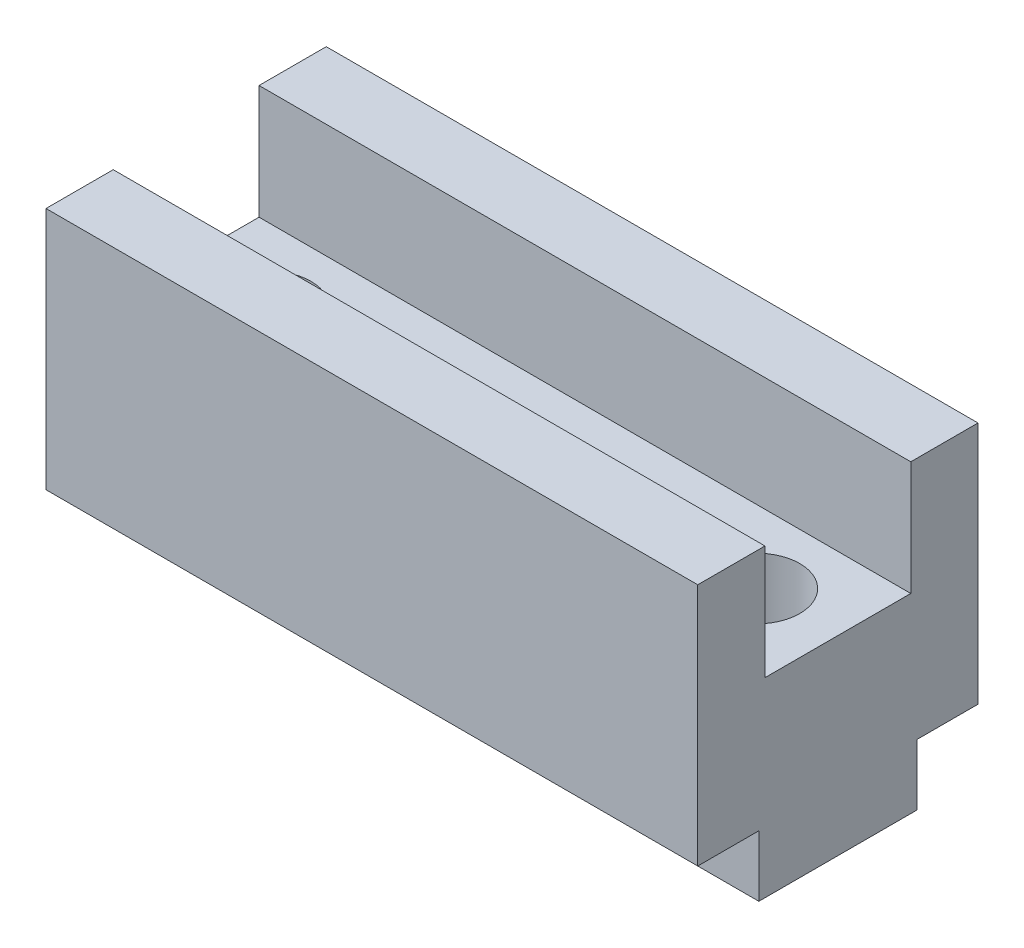
ISO-10303-21;
HEADER;
FILE_DESCRIPTION(('STEP AP214'),'2;1');
FILE_NAME('part.step','',(''),(''),'','','');
FILE_SCHEMA(('AUTOMOTIVE_DESIGN { 1 0 10303 214 1 1 1 1 }'));
ENDSEC;
DATA;
#1=APPLICATION_CONTEXT('core data for automotive mechanical design processes');
#2=APPLICATION_PROTOCOL_DEFINITION('international standard','automotive_design',2000,#1);
#3=PRODUCT_CONTEXT('',#1,'mechanical');
#4=PRODUCT('Part','Part','',(#3));
#5=PRODUCT_RELATED_PRODUCT_CATEGORY('part','',(#4));
#6=PRODUCT_DEFINITION_FORMATION('','',#4);
#7=PRODUCT_DEFINITION_CONTEXT('part definition',#1,'design');
#8=PRODUCT_DEFINITION('design','',#6,#7);
#9=PRODUCT_DEFINITION_SHAPE('','',#8);
#10=(LENGTH_UNIT() NAMED_UNIT(*) SI_UNIT(.MILLI.,.METRE.));
#11=(NAMED_UNIT(*) PLANE_ANGLE_UNIT() SI_UNIT($,.RADIAN.));
#12=(NAMED_UNIT(*) SI_UNIT($,.STERADIAN.) SOLID_ANGLE_UNIT());
#13=UNCERTAINTY_MEASURE_WITH_UNIT(LENGTH_MEASURE(1.E-05),#10,'distance_accuracy_value','');
#14=(GEOMETRIC_REPRESENTATION_CONTEXT(3) GLOBAL_UNCERTAINTY_ASSIGNED_CONTEXT((#13)) GLOBAL_UNIT_ASSIGNED_CONTEXT((#10,
#11,#12)) REPRESENTATION_CONTEXT('',''));
#15=CARTESIAN_POINT('',(0.,0.,0.));
#16=DIRECTION('',(0.,0.,1.));
#17=DIRECTION('',(1.,0.,0.));
#18=AXIS2_PLACEMENT_3D('',#15,#16,#17);
#19=CARTESIAN_POINT('',(0.,23.749,0.));
#20=DIRECTION('',(0.,-1.,0.));
#21=DIRECTION('',(0.,0.,-1.));
#22=AXIS2_PLACEMENT_3D('',#19,#20,#21);
#23=PLANE('',#22);
#24=DIRECTION('',(0.,0.,1.));
#25=VECTOR('',#24,1.);
#26=CARTESIAN_POINT('',(-25.4,23.749,10.922));
#27=LINE('',#26,#25);
#28=CARTESIAN_POINT('',(-25.4,23.749,-10.922));
#29=VERTEX_POINT('',#28);
#30=CARTESIAN_POINT('',(-25.4,23.749,-5.68325000000001));
#31=VERTEX_POINT('',#30);
#32=EDGE_CURVE('E204',#29,#31,#27,.T.);
#33=ORIENTED_EDGE('',*,*,#32,.T.);
#34=DIRECTION('',(1.,0.,0.));
#35=VECTOR('',#34,1.);
#36=CARTESIAN_POINT('',(0.,23.749,-5.68325000000001));
#37=LINE('',#36,#35);
#38=CARTESIAN_POINT('',(25.4,23.749,-5.68325000000001));
#39=VERTEX_POINT('',#38);
#40=EDGE_CURVE('E11',#31,#39,#37,.T.);
#41=ORIENTED_EDGE('',*,*,#40,.T.);
#42=DIRECTION('',(0.,0.,-1.));
#43=VECTOR('',#42,1.);
#44=CARTESIAN_POINT('',(25.4,23.749,10.922));
#45=LINE('',#44,#43);
#46=CARTESIAN_POINT('',(25.4,23.749,-10.922));
#47=VERTEX_POINT('',#46);
#48=EDGE_CURVE('E202',#39,#47,#45,.T.);
#49=ORIENTED_EDGE('',*,*,#48,.T.);
#50=DIRECTION('',(-1.,0.,0.));
#51=VECTOR('',#50,1.);
#52=CARTESIAN_POINT('',(-25.4,23.749,-10.922));
#53=LINE('',#52,#51);
#54=EDGE_CURVE('E201',#47,#29,#53,.T.);
#55=ORIENTED_EDGE('',*,*,#54,.T.);
#56=EDGE_LOOP('',(#33,#41,#49,#55));
#57=FACE_BOUND('',#56,.T.);
#58=ADVANCED_FACE('F34',(#57),#23,.F.);
#59=CARTESIAN_POINT('',(-25.4,23.749,-10.922));
#60=DIRECTION('',(0.,0.,1.));
#61=DIRECTION('',(1.,0.,0.));
#62=AXIS2_PLACEMENT_3D('',#59,#60,#61);
#63=PLANE('',#62);
#64=DIRECTION('',(1.,0.,0.));
#65=VECTOR('',#64,1.);
#66=CARTESIAN_POINT('',(-25.4,4.7625,-10.922));
#67=LINE('',#66,#65);
#68=CARTESIAN_POINT('',(-25.4,4.7625,-10.922));
#69=VERTEX_POINT('',#68);
#70=CARTESIAN_POINT('',(25.4,4.7625,-10.922));
#71=VERTEX_POINT('',#70);
#72=EDGE_CURVE('E158',#69,#71,#67,.T.);
#73=ORIENTED_EDGE('',*,*,#72,.F.);
#74=DIRECTION('',(0.,-1.,0.));
#75=VECTOR('',#74,1.);
#76=CARTESIAN_POINT('',(-25.4,23.749,-10.922));
#77=LINE('',#76,#75);
#78=EDGE_CURVE('E219',#29,#69,#77,.T.);
#79=ORIENTED_EDGE('',*,*,#78,.F.);
#80=ORIENTED_EDGE('',*,*,#54,.F.);
#81=DIRECTION('',(0.,-1.,0.));
#82=VECTOR('',#81,1.);
#83=CARTESIAN_POINT('',(25.4,23.749,-10.922));
#84=LINE('',#83,#82);
#85=EDGE_CURVE('E222',#47,#71,#84,.T.);
#86=ORIENTED_EDGE('',*,*,#85,.T.);
#87=EDGE_LOOP('',(#73,#79,#80,#86));
#88=FACE_BOUND('',#87,.T.);
#89=ADVANCED_FACE('F242',(#88),#63,.F.);
#90=CARTESIAN_POINT('',(-25.4,23.749,10.922));
#91=DIRECTION('',(0.,0.,-1.));
#92=DIRECTION('',(-1.,0.,0.));
#93=AXIS2_PLACEMENT_3D('',#90,#91,#92);
#94=PLANE('',#93);
#95=DIRECTION('',(-1.,0.,0.));
#96=VECTOR('',#95,1.);
#97=CARTESIAN_POINT('',(-25.4,4.7625,10.922));
#98=LINE('',#97,#96);
#99=CARTESIAN_POINT('',(25.4,4.7625,10.922));
#100=VERTEX_POINT('',#99);
#101=CARTESIAN_POINT('',(-25.4,4.7625,10.922));
#102=VERTEX_POINT('',#101);
#103=EDGE_CURVE('E182',#100,#102,#98,.T.);
#104=ORIENTED_EDGE('',*,*,#103,.F.);
#105=DIRECTION('',(0.,-1.,0.));
#106=VECTOR('',#105,1.);
#107=CARTESIAN_POINT('',(25.4,23.749,10.922));
#108=LINE('',#107,#106);
#109=CARTESIAN_POINT('',(25.4,23.749,10.922));
#110=VERTEX_POINT('',#109);
#111=EDGE_CURVE('E209',#110,#100,#108,.T.);
#112=ORIENTED_EDGE('',*,*,#111,.F.);
#113=DIRECTION('',(1.,0.,0.));
#114=VECTOR('',#113,1.);
#115=CARTESIAN_POINT('',(-25.4,23.749,10.922));
#116=LINE('',#115,#114);
#117=CARTESIAN_POINT('',(-25.4,23.749,10.922));
#118=VERTEX_POINT('',#117);
#119=EDGE_CURVE('E207',#118,#110,#116,.T.);
#120=ORIENTED_EDGE('',*,*,#119,.F.);
#121=DIRECTION('',(0.,-1.,0.));
#122=VECTOR('',#121,1.);
#123=CARTESIAN_POINT('',(-25.4,23.749,10.922));
#124=LINE('',#123,#122);
#125=EDGE_CURVE('E216',#118,#102,#124,.T.);
#126=ORIENTED_EDGE('',*,*,#125,.T.);
#127=EDGE_LOOP('',(#104,#112,#120,#126));
#128=FACE_BOUND('',#127,.T.);
#129=ADVANCED_FACE('F263',(#128),#94,.F.);
#130=CARTESIAN_POINT('',(25.4,23.749,10.922));
#131=DIRECTION('',(-1.,0.,0.));
#132=DIRECTION('',(0.,0.,1.));
#133=AXIS2_PLACEMENT_3D('',#130,#131,#132);
#134=PLANE('',#133);
#135=ORIENTED_EDGE('',*,*,#48,.F.);
#136=DIRECTION('',(0.,1.,0.));
#137=VECTOR('',#136,1.);
#138=CARTESIAN_POINT('',(25.4,32.639,-5.68325000000001));
#139=LINE('',#138,#137);
#140=CARTESIAN_POINT('',(25.4,14.859,-5.68325000000001));
#141=VERTEX_POINT('',#140);
#142=EDGE_CURVE('E148',#141,#39,#139,.T.);
#143=ORIENTED_EDGE('',*,*,#142,.F.);
#144=DIRECTION('',(0.,0.,-1.));
#145=VECTOR('',#144,1.);
#146=CARTESIAN_POINT('',(25.4,14.859,5.68324999999999));
#147=LINE('',#146,#145);
#148=CARTESIAN_POINT('',(25.4,14.859,5.68324999999999));
#149=VERTEX_POINT('',#148);
#150=EDGE_CURVE('E145',#149,#141,#147,.T.);
#151=ORIENTED_EDGE('',*,*,#150,.F.);
#152=DIRECTION('',(0.,-1.,0.));
#153=VECTOR('',#152,1.);
#154=CARTESIAN_POINT('',(25.4,32.639,5.68324999999999));
#155=LINE('',#154,#153);
#156=CARTESIAN_POINT('',(25.4,23.749,5.68324999999999));
#157=VERTEX_POINT('',#156);
#158=EDGE_CURVE('E125',#157,#149,#155,.T.);
#159=ORIENTED_EDGE('',*,*,#158,.F.);
#160=EDGE_CURVE('E198',#110,#157,#45,.T.);
#161=ORIENTED_EDGE('',*,*,#160,.F.);
#162=ORIENTED_EDGE('',*,*,#111,.T.);
#163=DIRECTION('',(0.,0.,1.));
#164=VECTOR('',#163,1.);
#165=CARTESIAN_POINT('',(25.4,4.7625,10.922));
#166=LINE('',#165,#164);
#167=CARTESIAN_POINT('',(25.4,4.7625,6.1595));
#168=VERTEX_POINT('',#167);
#169=EDGE_CURVE('E180',#168,#100,#166,.T.);
#170=ORIENTED_EDGE('',*,*,#169,.F.);
#171=DIRECTION('',(0.,-1.,0.));
#172=VECTOR('',#171,1.);
#173=CARTESIAN_POINT('',(25.4,4.7625,6.1595));
#174=LINE('',#173,#172);
#175=CARTESIAN_POINT('',(25.4,0.,6.1595));
#176=VERTEX_POINT('',#175);
#177=EDGE_CURVE('E186',#168,#176,#174,.T.);
#178=ORIENTED_EDGE('',*,*,#177,.T.);
#179=DIRECTION('',(0.,0.,-1.));
#180=VECTOR('',#179,1.);
#181=CARTESIAN_POINT('',(25.4,0.,10.922));
#182=LINE('',#181,#180);
#183=CARTESIAN_POINT('',(25.4,0.,-6.1595));
#184=VERTEX_POINT('',#183);
#185=EDGE_CURVE('E197',#176,#184,#182,.T.);
#186=ORIENTED_EDGE('',*,*,#185,.T.);
#187=DIRECTION('',(0.,-1.,0.));
#188=VECTOR('',#187,1.);
#189=CARTESIAN_POINT('',(25.4,4.7625,-6.1595));
#190=LINE('',#189,#188);
#191=CARTESIAN_POINT('',(25.4,4.7625,-6.1595));
#192=VERTEX_POINT('',#191);
#193=EDGE_CURVE('E57',#192,#184,#190,.T.);
#194=ORIENTED_EDGE('',*,*,#193,.F.);
#195=DIRECTION('',(0.,0.,1.));
#196=VECTOR('',#195,1.);
#197=CARTESIAN_POINT('',(25.4,4.7625,-10.922));
#198=LINE('',#197,#196);
#199=EDGE_CURVE('E160',#71,#192,#198,.T.);
#200=ORIENTED_EDGE('',*,*,#199,.F.);
#201=ORIENTED_EDGE('',*,*,#85,.F.);
#202=EDGE_LOOP('',(#135,#143,#151,#159,#161,#162,#170,#178,#186,#194,#200,#201));
#203=FACE_BOUND('',#202,.T.);
#204=ADVANCED_FACE('F36',(#203),#134,.F.);
#205=CARTESIAN_POINT('',(-25.4,23.749,10.922));
#206=DIRECTION('',(1.,0.,0.));
#207=DIRECTION('',(0.,0.,-1.));
#208=AXIS2_PLACEMENT_3D('',#205,#206,#207);
#209=PLANE('',#208);
#210=DIRECTION('',(0.,0.,-1.));
#211=VECTOR('',#210,1.);
#212=CARTESIAN_POINT('',(-25.4,14.859,5.68324999999999));
#213=LINE('',#212,#211);
#214=CARTESIAN_POINT('',(-25.4,14.859,5.68324999999999));
#215=VERTEX_POINT('',#214);
#216=CARTESIAN_POINT('',(-25.4,14.859,-5.68325000000001));
#217=VERTEX_POINT('',#216);
#218=EDGE_CURVE('E130',#215,#217,#213,.T.);
#219=ORIENTED_EDGE('',*,*,#218,.T.);
#220=DIRECTION('',(0.,1.,0.));
#221=VECTOR('',#220,1.);
#222=CARTESIAN_POINT('',(-25.4,32.639,-5.68325000000001));
#223=LINE('',#222,#221);
#224=EDGE_CURVE('E143',#217,#31,#223,.T.);
#225=ORIENTED_EDGE('',*,*,#224,.T.);
#226=ORIENTED_EDGE('',*,*,#32,.F.);
#227=ORIENTED_EDGE('',*,*,#78,.T.);
#228=DIRECTION('',(0.,0.,-1.));
#229=VECTOR('',#228,1.);
#230=CARTESIAN_POINT('',(-25.4,4.7625,-10.922));
#231=LINE('',#230,#229);
#232=CARTESIAN_POINT('',(-25.4,4.7625,-6.1595));
#233=VERTEX_POINT('',#232);
#234=EDGE_CURVE('E166',#233,#69,#231,.T.);
#235=ORIENTED_EDGE('',*,*,#234,.F.);
#236=DIRECTION('',(0.,-1.,0.));
#237=VECTOR('',#236,1.);
#238=CARTESIAN_POINT('',(-25.4,4.7625,-6.1595));
#239=LINE('',#238,#237);
#240=CARTESIAN_POINT('',(-25.4,0.,-6.1595));
#241=VERTEX_POINT('',#240);
#242=EDGE_CURVE('E169',#233,#241,#239,.T.);
#243=ORIENTED_EDGE('',*,*,#242,.T.);
#244=DIRECTION('',(0.,0.,1.));
#245=VECTOR('',#244,1.);
#246=CARTESIAN_POINT('',(-25.4,0.,10.922));
#247=LINE('',#246,#245);
#248=CARTESIAN_POINT('',(-25.4,0.,6.1595));
#249=VERTEX_POINT('',#248);
#250=EDGE_CURVE('E212',#241,#249,#247,.T.);
#251=ORIENTED_EDGE('',*,*,#250,.T.);
#252=DIRECTION('',(0.,-1.,0.));
#253=VECTOR('',#252,1.);
#254=CARTESIAN_POINT('',(-25.4,4.7625,6.1595));
#255=LINE('',#254,#253);
#256=CARTESIAN_POINT('',(-25.4,4.7625,6.1595));
#257=VERTEX_POINT('',#256);
#258=EDGE_CURVE('E184',#257,#249,#255,.T.);
#259=ORIENTED_EDGE('',*,*,#258,.F.);
#260=DIRECTION('',(0.,0.,-1.));
#261=VECTOR('',#260,1.);
#262=CARTESIAN_POINT('',(-25.4,4.7625,10.922));
#263=LINE('',#262,#261);
#264=EDGE_CURVE('E174',#102,#257,#263,.T.);
#265=ORIENTED_EDGE('',*,*,#264,.F.);
#266=ORIENTED_EDGE('',*,*,#125,.F.);
#267=CARTESIAN_POINT('',(-25.4,23.749,5.68324999999999));
#268=VERTEX_POINT('',#267);
#269=EDGE_CURVE('E142',#268,#118,#27,.T.);
#270=ORIENTED_EDGE('',*,*,#269,.F.);
#271=DIRECTION('',(0.,-1.,0.));
#272=VECTOR('',#271,1.);
#273=CARTESIAN_POINT('',(-25.4,32.639,5.68324999999999));
#274=LINE('',#273,#272);
#275=EDGE_CURVE('E49',#268,#215,#274,.T.);
#276=ORIENTED_EDGE('',*,*,#275,.T.);
#277=EDGE_LOOP('',(#219,#225,#226,#227,#235,#243,#251,#259,#265,#266,#270,#276));
#278=FACE_BOUND('',#277,.T.);
#279=ADVANCED_FACE('F140',(#278),#209,.F.);
#280=ORIENTED_EDGE('',*,*,#160,.T.);
#281=DIRECTION('',(-1.,0.,0.));
#282=VECTOR('',#281,1.);
#283=CARTESIAN_POINT('',(0.,23.749,5.68324999999999));
#284=LINE('',#283,#282);
#285=EDGE_CURVE('E42',#157,#268,#284,.T.);
#286=ORIENTED_EDGE('',*,*,#285,.T.);
#287=ORIENTED_EDGE('',*,*,#269,.T.);
#288=ORIENTED_EDGE('',*,*,#119,.T.);
#289=EDGE_LOOP('',(#280,#286,#287,#288));
#290=FACE_BOUND('',#289,.T.);
#291=ADVANCED_FACE('F227',(#290),#23,.F.);
#292=CARTESIAN_POINT('',(0.,0.,0.));
#293=DIRECTION('',(0.,-1.,0.));
#294=DIRECTION('',(0.,0.,-1.));
#295=AXIS2_PLACEMENT_3D('',#292,#293,#294);
#296=PLANE('',#295);
#297=DIRECTION('',(-1.,0.,0.));
#298=VECTOR('',#297,1.);
#299=CARTESIAN_POINT('',(-25.4,0.,-6.1595));
#300=LINE('',#299,#298);
#301=EDGE_CURVE('E157',#184,#241,#300,.T.);
#302=ORIENTED_EDGE('',*,*,#301,.F.);
#303=ORIENTED_EDGE('',*,*,#185,.F.);
#304=DIRECTION('',(1.,0.,0.));
#305=VECTOR('',#304,1.);
#306=CARTESIAN_POINT('',(-25.4,0.,6.1595));
#307=LINE('',#306,#305);
#308=EDGE_CURVE('E172',#249,#176,#307,.T.);
#309=ORIENTED_EDGE('',*,*,#308,.F.);
#310=ORIENTED_EDGE('',*,*,#250,.F.);
#311=EDGE_LOOP('',(#302,#303,#309,#310));
#312=FACE_BOUND('',#311,.T.);
#313=CARTESIAN_POINT('',(-19.05,0.,0.));
#314=DIRECTION('',(0.,-1.,0.));
#315=DIRECTION('',(0.,0.,-1.));
#316=AXIS2_PLACEMENT_3D('',#313,#314,#315);
#317=CIRCLE('',#316,3.37819999999999);
#318=CARTESIAN_POINT('',(-19.05,0.,-3.37819999999999));
#319=VERTEX_POINT('',#318);
#320=EDGE_CURVE('E189',#319,#319,#317,.T.);
#321=ORIENTED_EDGE('',*,*,#320,.F.);
#322=EDGE_LOOP('',(#321));
#323=FACE_BOUND('',#322,.T.);
#324=CARTESIAN_POINT('',(19.05,0.,0.));
#325=DIRECTION('',(0.,-1.,0.));
#326=DIRECTION('',(0.,0.,-1.));
#327=AXIS2_PLACEMENT_3D('',#324,#325,#326);
#328=CIRCLE('',#327,3.37819999999999);
#329=CARTESIAN_POINT('',(19.05,0.,-3.37819999999999));
#330=VERTEX_POINT('',#329);
#331=EDGE_CURVE('E194',#330,#330,#328,.T.);
#332=ORIENTED_EDGE('',*,*,#331,.F.);
#333=EDGE_LOOP('',(#332));
#334=FACE_BOUND('',#333,.T.);
#335=ADVANCED_FACE('F250',(#312,#323,#334),#296,.T.);
#336=CARTESIAN_POINT('',(19.05,23.749,0.));
#337=DIRECTION('',(0.,1.,0.));
#338=DIRECTION('',(0.,0.,1.));
#339=AXIS2_PLACEMENT_3D('',#336,#337,#338);
#340=CYLINDRICAL_SURFACE('',#339,3.37819999999999);
#341=CARTESIAN_POINT('',(19.05,14.859,0.));
#342=DIRECTION('',(0.,-1.,0.));
#343=DIRECTION('',(0.,0.,-1.));
#344=AXIS2_PLACEMENT_3D('',#341,#342,#343);
#345=CIRCLE('',#344,3.37819999999999);
#346=CARTESIAN_POINT('',(19.05,14.859,-3.37819999999999));
#347=VERTEX_POINT('',#346);
#348=EDGE_CURVE('E154',#347,#347,#345,.F.);
#349=ORIENTED_EDGE('',*,*,#348,.T.);
#350=EDGE_LOOP('',(#349));
#351=FACE_BOUND('',#350,.T.);
#352=ORIENTED_EDGE('',*,*,#331,.T.);
#353=EDGE_LOOP('',(#352));
#354=FACE_BOUND('',#353,.T.);
#355=ADVANCED_FACE('F283',(#351,#354),#340,.F.);
#356=CARTESIAN_POINT('',(-19.05,23.749,0.));
#357=DIRECTION('',(0.,1.,0.));
#358=DIRECTION('',(0.,0.,1.));
#359=AXIS2_PLACEMENT_3D('',#356,#357,#358);
#360=CYLINDRICAL_SURFACE('',#359,3.37819999999999);
#361=CARTESIAN_POINT('',(-19.05,14.859,0.));
#362=DIRECTION('',(0.,-1.,0.));
#363=DIRECTION('',(0.,0.,-1.));
#364=AXIS2_PLACEMENT_3D('',#361,#362,#363);
#365=CIRCLE('',#364,3.37819999999999);
#366=CARTESIAN_POINT('',(-19.05,14.859,-3.37819999999999));
#367=VERTEX_POINT('',#366);
#368=EDGE_CURVE('E152',#367,#367,#365,.F.);
#369=ORIENTED_EDGE('',*,*,#368,.T.);
#370=EDGE_LOOP('',(#369));
#371=FACE_BOUND('',#370,.T.);
#372=ORIENTED_EDGE('',*,*,#320,.T.);
#373=EDGE_LOOP('',(#372));
#374=FACE_BOUND('',#373,.T.);
#375=ADVANCED_FACE('F329',(#371,#374),#360,.F.);
#376=CARTESIAN_POINT('',(-25.4,4.7625,6.1595));
#377=DIRECTION('',(0.,0.,-1.));
#378=DIRECTION('',(-1.,0.,0.));
#379=AXIS2_PLACEMENT_3D('',#376,#377,#378);
#380=PLANE('',#379);
#381=ORIENTED_EDGE('',*,*,#308,.T.);
#382=ORIENTED_EDGE('',*,*,#177,.F.);
#383=DIRECTION('',(1.,0.,0.));
#384=VECTOR('',#383,1.);
#385=CARTESIAN_POINT('',(-25.4,4.7625,6.1595));
#386=LINE('',#385,#384);
#387=EDGE_CURVE('E177',#257,#168,#386,.T.);
#388=ORIENTED_EDGE('',*,*,#387,.F.);
#389=ORIENTED_EDGE('',*,*,#258,.T.);
#390=EDGE_LOOP('',(#381,#382,#388,#389));
#391=FACE_BOUND('',#390,.T.);
#392=ADVANCED_FACE('F257',(#391),#380,.F.);
#393=CARTESIAN_POINT('',(0.,4.7625,0.));
#394=DIRECTION('',(0.,-1.,0.));
#395=DIRECTION('',(0.,0.,-1.));
#396=AXIS2_PLACEMENT_3D('',#393,#394,#395);
#397=PLANE('',#396);
#398=ORIENTED_EDGE('',*,*,#264,.T.);
#399=ORIENTED_EDGE('',*,*,#387,.T.);
#400=ORIENTED_EDGE('',*,*,#169,.T.);
#401=ORIENTED_EDGE('',*,*,#103,.T.);
#402=EDGE_LOOP('',(#398,#399,#400,#401));
#403=FACE_BOUND('',#402,.T.);
#404=ADVANCED_FACE('F259',(#403),#397,.T.);
#405=CARTESIAN_POINT('',(-25.4,4.7625,-6.1595));
#406=DIRECTION('',(0.,0.,1.));
#407=DIRECTION('',(1.,0.,0.));
#408=AXIS2_PLACEMENT_3D('',#405,#406,#407);
#409=PLANE('',#408);
#410=ORIENTED_EDGE('',*,*,#301,.T.);
#411=ORIENTED_EDGE('',*,*,#242,.F.);
#412=DIRECTION('',(-1.,0.,0.));
#413=VECTOR('',#412,1.);
#414=CARTESIAN_POINT('',(-25.4,4.7625,-6.1595));
#415=LINE('',#414,#413);
#416=EDGE_CURVE('E163',#192,#233,#415,.T.);
#417=ORIENTED_EDGE('',*,*,#416,.F.);
#418=ORIENTED_EDGE('',*,*,#193,.T.);
#419=EDGE_LOOP('',(#410,#411,#417,#418));
#420=FACE_BOUND('',#419,.T.);
#421=ADVANCED_FACE('F253',(#420),#409,.F.);
#422=CARTESIAN_POINT('',(0.,4.7625,0.));
#423=DIRECTION('',(0.,-1.,0.));
#424=DIRECTION('',(0.,0.,-1.));
#425=AXIS2_PLACEMENT_3D('',#422,#423,#424);
#426=PLANE('',#425);
#427=ORIENTED_EDGE('',*,*,#72,.T.);
#428=ORIENTED_EDGE('',*,*,#199,.T.);
#429=ORIENTED_EDGE('',*,*,#416,.T.);
#430=ORIENTED_EDGE('',*,*,#234,.T.);
#431=EDGE_LOOP('',(#427,#428,#429,#430));
#432=FACE_BOUND('',#431,.T.);
#433=ADVANCED_FACE('F245',(#432),#426,.T.);
#434=CARTESIAN_POINT('',(-25.4,32.639,-5.68325000000001));
#435=DIRECTION('',(0.,0.,-1.));
#436=DIRECTION('',(-1.,0.,0.));
#437=AXIS2_PLACEMENT_3D('',#434,#435,#436);
#438=PLANE('',#437);
#439=ORIENTED_EDGE('',*,*,#224,.F.);
#440=DIRECTION('',(1.,0.,0.));
#441=VECTOR('',#440,1.);
#442=CARTESIAN_POINT('',(-25.4,14.859,-5.68325000000001));
#443=LINE('',#442,#441);
#444=EDGE_CURVE('E129',#217,#141,#443,.T.);
#445=ORIENTED_EDGE('',*,*,#444,.T.);
#446=ORIENTED_EDGE('',*,*,#142,.T.);
#447=ORIENTED_EDGE('',*,*,#40,.F.);
#448=EDGE_LOOP('',(#439,#445,#446,#447));
#449=FACE_BOUND('',#448,.T.);
#450=ADVANCED_FACE('F234',(#449),#438,.F.);
#451=CARTESIAN_POINT('',(-25.4,32.639,5.68324999999999));
#452=DIRECTION('',(0.,0.,1.));
#453=DIRECTION('',(0.,-1.,0.));
#454=AXIS2_PLACEMENT_3D('',#451,#452,#453);
#455=PLANE('',#454);
#456=ORIENTED_EDGE('',*,*,#158,.T.);
#457=DIRECTION('',(1.,0.,0.));
#458=VECTOR('',#457,1.);
#459=CARTESIAN_POINT('',(-25.4,14.859,5.68324999999999));
#460=LINE('',#459,#458);
#461=EDGE_CURVE('E121',#215,#149,#460,.T.);
#462=ORIENTED_EDGE('',*,*,#461,.F.);
#463=ORIENTED_EDGE('',*,*,#275,.F.);
#464=ORIENTED_EDGE('',*,*,#285,.F.);
#465=EDGE_LOOP('',(#456,#462,#463,#464));
#466=FACE_BOUND('',#465,.T.);
#467=ADVANCED_FACE('F123',(#466),#455,.F.);
#468=CARTESIAN_POINT('',(-25.4,14.859,5.68324999999999));
#469=DIRECTION('',(0.,-1.,0.));
#470=DIRECTION('',(0.,0.,-1.));
#471=AXIS2_PLACEMENT_3D('',#468,#469,#470);
#472=PLANE('',#471);
#473=ORIENTED_EDGE('',*,*,#368,.F.);
#474=EDGE_LOOP('',(#473));
#475=FACE_BOUND('',#474,.T.);
#476=ORIENTED_EDGE('',*,*,#150,.T.);
#477=ORIENTED_EDGE('',*,*,#444,.F.);
#478=ORIENTED_EDGE('',*,*,#218,.F.);
#479=ORIENTED_EDGE('',*,*,#461,.T.);
#480=EDGE_LOOP('',(#476,#477,#478,#479));
#481=FACE_BOUND('',#480,.T.);
#482=ORIENTED_EDGE('',*,*,#348,.F.);
#483=EDGE_LOOP('',(#482));
#484=FACE_BOUND('',#483,.T.);
#485=ADVANCED_FACE('F133',(#475,#481,#484),#472,.F.);
#486=CLOSED_SHELL('',(#58,#89,#129,#204,#279,#291,#335,#355,#375,#392,#404,#421,#433,#450,#467,#485));
#487=MANIFOLD_SOLID_BREP('B2',#486);
#488=ADVANCED_BREP_SHAPE_REPRESENTATION('',(#18,#487),#14);
#489=SHAPE_DEFINITION_REPRESENTATION(#9,#488);
ENDSEC;
END-ISO-10303-21;
